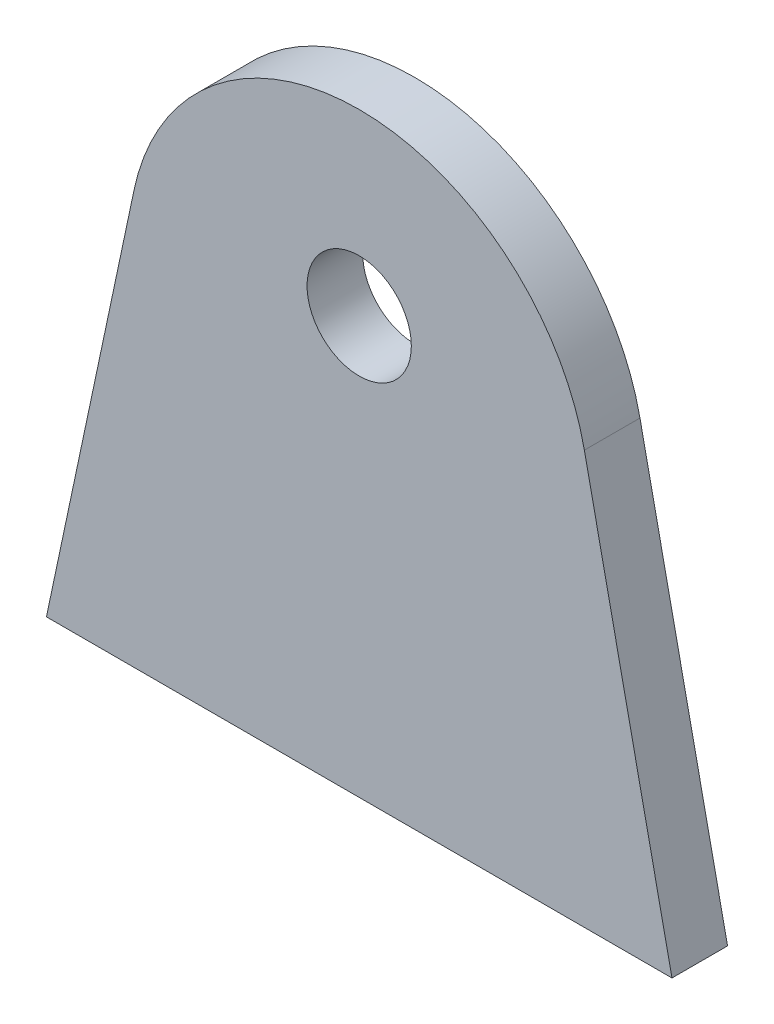
ISO-10303-21;
HEADER;
FILE_DESCRIPTION(('STEP AP214'),'2;1');
FILE_NAME('part.step','',(''),(''),'','','');
FILE_SCHEMA(('AUTOMOTIVE_DESIGN { 1 0 10303 214 1 1 1 1 }'));
ENDSEC;
DATA;
#1=APPLICATION_CONTEXT('core data for automotive mechanical design processes');
#2=APPLICATION_PROTOCOL_DEFINITION('international standard','automotive_design',2000,#1);
#3=PRODUCT_CONTEXT('',#1,'mechanical');
#4=PRODUCT('Part','Part','',(#3));
#5=PRODUCT_RELATED_PRODUCT_CATEGORY('part','',(#4));
#6=PRODUCT_DEFINITION_FORMATION('','',#4);
#7=PRODUCT_DEFINITION_CONTEXT('part definition',#1,'design');
#8=PRODUCT_DEFINITION('design','',#6,#7);
#9=PRODUCT_DEFINITION_SHAPE('','',#8);
#10=(LENGTH_UNIT() NAMED_UNIT(*) SI_UNIT(.MILLI.,.METRE.));
#11=(NAMED_UNIT(*) PLANE_ANGLE_UNIT() SI_UNIT($,.RADIAN.));
#12=(NAMED_UNIT(*) SI_UNIT($,.STERADIAN.) SOLID_ANGLE_UNIT());
#13=UNCERTAINTY_MEASURE_WITH_UNIT(LENGTH_MEASURE(1.E-05),#10,'distance_accuracy_value','');
#14=(GEOMETRIC_REPRESENTATION_CONTEXT(3) GLOBAL_UNCERTAINTY_ASSIGNED_CONTEXT((#13)) GLOBAL_UNIT_ASSIGNED_CONTEXT((#10,
#11,#12)) REPRESENTATION_CONTEXT('',''));
#15=CARTESIAN_POINT('',(0.,0.,0.));
#16=DIRECTION('',(0.,0.,1.));
#17=DIRECTION('',(1.,0.,0.));
#18=AXIS2_PLACEMENT_3D('',#15,#16,#17);
#19=CARTESIAN_POINT('',(0.,0.,-2.54));
#20=DIRECTION('',(-0.978270611850224,0.207332124838839,0.));
#21=DIRECTION('',(-0.207332124838839,-0.978270611850224,0.));
#22=AXIS2_PLACEMENT_3D('',#19,#20,#21);
#23=PLANE('',#22);
#24=DIRECTION('',(-0.207332124838839,-0.978270611850224,0.));
#25=VECTOR('',#24,1.);
#26=CARTESIAN_POINT('',(0.,0.,0.));
#27=LINE('',#26,#25);
#28=CARTESIAN_POINT('',(4.00176595925236,18.8818304760163,0.));
#29=VERTEX_POINT('',#28);
#30=CARTESIAN_POINT('',(0.,0.,0.));
#31=VERTEX_POINT('',#30);
#32=EDGE_CURVE('E110',#29,#31,#27,.T.);
#33=ORIENTED_EDGE('',*,*,#32,.F.);
#34=DIRECTION('',(0.,0.,1.));
#35=VECTOR('',#34,1.);
#36=CARTESIAN_POINT('',(4.00176595925236,18.8818304760163,-2.54));
#37=LINE('',#36,#35);
#38=CARTESIAN_POINT('',(4.00176595925236,18.8818304760163,-2.54));
#39=VERTEX_POINT('',#38);
#40=EDGE_CURVE('E11',#39,#29,#37,.T.);
#41=ORIENTED_EDGE('',*,*,#40,.F.);
#42=DIRECTION('',(-0.207332124838839,-0.978270611850224,0.));
#43=VECTOR('',#42,1.);
#44=CARTESIAN_POINT('',(0.,0.,-2.54));
#45=LINE('',#44,#43);
#46=CARTESIAN_POINT('',(0.,0.,-2.54));
#47=VERTEX_POINT('',#46);
#48=EDGE_CURVE('E101',#39,#47,#45,.T.);
#49=ORIENTED_EDGE('',*,*,#48,.T.);
#50=DIRECTION('',(0.,0.,1.));
#51=VECTOR('',#50,1.);
#52=CARTESIAN_POINT('',(0.,0.,-2.54));
#53=LINE('',#52,#51);
#54=EDGE_CURVE('E42',#47,#31,#53,.T.);
#55=ORIENTED_EDGE('',*,*,#54,.T.);
#56=EDGE_LOOP('',(#33,#41,#49,#55));
#57=FACE_BOUND('',#56,.T.);
#58=ADVANCED_FACE('F39',(#57),#23,.T.);
#59=CARTESIAN_POINT('',(14.2875,16.7018988002992,-2.54));
#60=DIRECTION('',(0.,0.,1.));
#61=DIRECTION('',(1.,0.,0.));
#62=AXIS2_PLACEMENT_3D('',#59,#60,#61);
#63=CYLINDRICAL_SURFACE('',#62,10.5142011997008);
#64=CARTESIAN_POINT('',(14.2875,16.7018988002992,0.));
#65=DIRECTION('',(0.,0.,1.));
#66=DIRECTION('',(-1.,0.,0.));
#67=AXIS2_PLACEMENT_3D('',#64,#65,#66);
#68=CIRCLE('',#67,10.5142011997008);
#69=CARTESIAN_POINT('',(24.5732340407476,18.8818304760163,0.));
#70=VERTEX_POINT('',#69);
#71=EDGE_CURVE('E104',#70,#29,#68,.T.);
#72=ORIENTED_EDGE('',*,*,#71,.F.);
#73=DIRECTION('',(0.,0.,1.));
#74=VECTOR('',#73,1.);
#75=CARTESIAN_POINT('',(24.5732340407476,18.8818304760163,-2.54));
#76=LINE('',#75,#74);
#77=CARTESIAN_POINT('',(24.5732340407476,18.8818304760163,-2.54));
#78=VERTEX_POINT('',#77);
#79=EDGE_CURVE('E49',#78,#70,#76,.T.);
#80=ORIENTED_EDGE('',*,*,#79,.F.);
#81=CARTESIAN_POINT('',(14.2875,16.7018988002992,-2.54));
#82=DIRECTION('',(0.,0.,1.));
#83=DIRECTION('',(-1.,0.,0.));
#84=AXIS2_PLACEMENT_3D('',#81,#82,#83);
#85=CIRCLE('',#84,10.5142011997008);
#86=EDGE_CURVE('E96',#78,#39,#85,.T.);
#87=ORIENTED_EDGE('',*,*,#86,.T.);
#88=ORIENTED_EDGE('',*,*,#40,.T.);
#89=EDGE_LOOP('',(#72,#80,#87,#88));
#90=FACE_BOUND('',#89,.T.);
#91=ADVANCED_FACE('F127',(#90),#63,.T.);
#92=CARTESIAN_POINT('',(24.5732340407476,18.8818304760163,-2.54));
#93=DIRECTION('',(0.978270611850224,0.20733212483884,0.));
#94=DIRECTION('',(-0.20733212483884,0.978270611850224,0.));
#95=AXIS2_PLACEMENT_3D('',#92,#93,#94);
#96=PLANE('',#95);
#97=DIRECTION('',(-0.20733212483884,0.978270611850224,0.));
#98=VECTOR('',#97,1.);
#99=CARTESIAN_POINT('',(24.5732340407476,18.8818304760163,0.));
#100=LINE('',#99,#98);
#101=CARTESIAN_POINT('',(28.575,0.,0.));
#102=VERTEX_POINT('',#101);
#103=EDGE_CURVE('E90',#102,#70,#100,.T.);
#104=ORIENTED_EDGE('',*,*,#103,.F.);
#105=DIRECTION('',(0.,0.,1.));
#106=VECTOR('',#105,1.);
#107=CARTESIAN_POINT('',(28.575,0.,-2.54));
#108=LINE('',#107,#106);
#109=CARTESIAN_POINT('',(28.575,0.,-2.54));
#110=VERTEX_POINT('',#109);
#111=EDGE_CURVE('E85',#110,#102,#108,.T.);
#112=ORIENTED_EDGE('',*,*,#111,.F.);
#113=DIRECTION('',(-0.20733212483884,0.978270611850224,0.));
#114=VECTOR('',#113,1.);
#115=CARTESIAN_POINT('',(24.5732340407476,18.8818304760163,-2.54));
#116=LINE('',#115,#114);
#117=EDGE_CURVE('E88',#110,#78,#116,.T.);
#118=ORIENTED_EDGE('',*,*,#117,.T.);
#119=ORIENTED_EDGE('',*,*,#79,.T.);
#120=EDGE_LOOP('',(#104,#112,#118,#119));
#121=FACE_BOUND('',#120,.T.);
#122=ADVANCED_FACE('F87',(#121),#96,.T.);
#123=CARTESIAN_POINT('',(0.,0.,-2.54));
#124=DIRECTION('',(0.,-1.,0.));
#125=DIRECTION('',(0.,0.,-1.));
#126=AXIS2_PLACEMENT_3D('',#123,#124,#125);
#127=PLANE('',#126);
#128=DIRECTION('',(1.,0.,0.));
#129=VECTOR('',#128,1.);
#130=CARTESIAN_POINT('',(0.,0.,0.));
#131=LINE('',#130,#129);
#132=EDGE_CURVE('E114',#31,#102,#131,.T.);
#133=ORIENTED_EDGE('',*,*,#132,.F.);
#134=ORIENTED_EDGE('',*,*,#54,.F.);
#135=DIRECTION('',(1.,0.,0.));
#136=VECTOR('',#135,1.);
#137=CARTESIAN_POINT('',(0.,0.,-2.54));
#138=LINE('',#137,#136);
#139=EDGE_CURVE('E95',#47,#110,#138,.T.);
#140=ORIENTED_EDGE('',*,*,#139,.T.);
#141=ORIENTED_EDGE('',*,*,#111,.T.);
#142=EDGE_LOOP('',(#133,#134,#140,#141));
#143=FACE_BOUND('',#142,.T.);
#144=ADVANCED_FACE('F99',(#143),#127,.T.);
#145=CARTESIAN_POINT('',(14.2875,16.7018988002992,-2.54));
#146=DIRECTION('',(0.,0.,-1.));
#147=DIRECTION('',(-1.,0.,0.));
#148=AXIS2_PLACEMENT_3D('',#145,#146,#147);
#149=PLANE('',#148);
#150=CARTESIAN_POINT('',(14.2875,19.05,-2.54));
#151=DIRECTION('',(0.,0.,1.));
#152=DIRECTION('',(1.,0.,0.));
#153=AXIS2_PLACEMENT_3D('',#150,#151,#152);
#154=CIRCLE('',#153,2.38125);
#155=CARTESIAN_POINT('',(16.66875,19.05,-2.54));
#156=VERTEX_POINT('',#155);
#157=EDGE_CURVE('E115',#156,#156,#154,.T.);
#158=ORIENTED_EDGE('',*,*,#157,.T.);
#159=EDGE_LOOP('',(#158));
#160=FACE_BOUND('',#159,.T.);
#161=ORIENTED_EDGE('',*,*,#48,.F.);
#162=ORIENTED_EDGE('',*,*,#86,.F.);
#163=ORIENTED_EDGE('',*,*,#117,.F.);
#164=ORIENTED_EDGE('',*,*,#139,.F.);
#165=EDGE_LOOP('',(#161,#162,#163,#164));
#166=FACE_BOUND('',#165,.T.);
#167=ADVANCED_FACE('F94',(#160,#166),#149,.T.);
#168=CARTESIAN_POINT('',(14.2875,16.7018988002992,0.));
#169=DIRECTION('',(0.,0.,-1.));
#170=DIRECTION('',(-1.,0.,0.));
#171=AXIS2_PLACEMENT_3D('',#168,#169,#170);
#172=PLANE('',#171);
#173=CARTESIAN_POINT('',(14.2875,19.05,0.));
#174=DIRECTION('',(0.,0.,1.));
#175=DIRECTION('',(1.,0.,0.));
#176=AXIS2_PLACEMENT_3D('',#173,#174,#175);
#177=CIRCLE('',#176,2.38125);
#178=CARTESIAN_POINT('',(16.66875,19.05,0.));
#179=VERTEX_POINT('',#178);
#180=EDGE_CURVE('E157',#179,#179,#177,.T.);
#181=ORIENTED_EDGE('',*,*,#180,.F.);
#182=EDGE_LOOP('',(#181));
#183=FACE_BOUND('',#182,.T.);
#184=ORIENTED_EDGE('',*,*,#32,.T.);
#185=ORIENTED_EDGE('',*,*,#132,.T.);
#186=ORIENTED_EDGE('',*,*,#103,.T.);
#187=ORIENTED_EDGE('',*,*,#71,.T.);
#188=EDGE_LOOP('',(#184,#185,#186,#187));
#189=FACE_BOUND('',#188,.T.);
#190=ADVANCED_FACE('F126',(#183,#189),#172,.F.);
#191=CARTESIAN_POINT('',(14.2875,19.05,-2.54));
#192=DIRECTION('',(0.,0.,1.));
#193=DIRECTION('',(1.,0.,0.));
#194=AXIS2_PLACEMENT_3D('',#191,#192,#193);
#195=CYLINDRICAL_SURFACE('',#194,2.38125);
#196=ORIENTED_EDGE('',*,*,#157,.F.);
#197=EDGE_LOOP('',(#196));
#198=FACE_BOUND('',#197,.T.);
#199=ORIENTED_EDGE('',*,*,#180,.T.);
#200=EDGE_LOOP('',(#199));
#201=FACE_BOUND('',#200,.T.);
#202=ADVANCED_FACE('F145',(#198,#201),#195,.F.);
#203=CLOSED_SHELL('',(#58,#91,#122,#144,#167,#190,#202));
#204=MANIFOLD_SOLID_BREP('B2',#203);
#205=ADVANCED_BREP_SHAPE_REPRESENTATION('',(#18,#204),#14);
#206=SHAPE_DEFINITION_REPRESENTATION(#9,#205);
ENDSEC;
END-ISO-10303-21;
